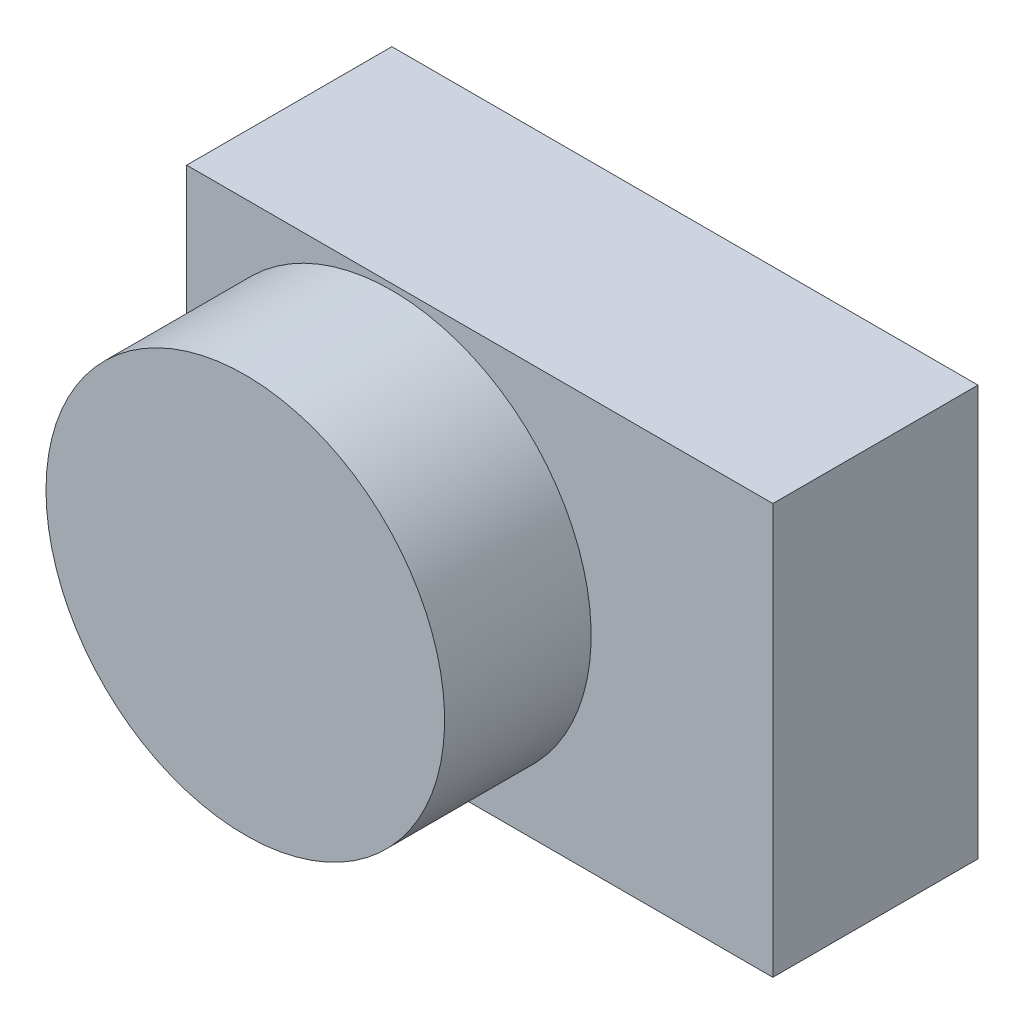
ISO-10303-21;
HEADER;
FILE_DESCRIPTION(('STEP AP214'),'2;1');
FILE_NAME('part.step','',(''),(''),'','','');
FILE_SCHEMA(('AUTOMOTIVE_DESIGN { 1 0 10303 214 1 1 1 1 }'));
ENDSEC;
DATA;
#1=APPLICATION_CONTEXT('core data for automotive mechanical design processes');
#2=APPLICATION_PROTOCOL_DEFINITION('international standard','automotive_design',2000,#1);
#3=PRODUCT_CONTEXT('',#1,'mechanical');
#4=PRODUCT('Part','Part','',(#3));
#5=PRODUCT_RELATED_PRODUCT_CATEGORY('part','',(#4));
#6=PRODUCT_DEFINITION_FORMATION('','',#4);
#7=PRODUCT_DEFINITION_CONTEXT('part definition',#1,'design');
#8=PRODUCT_DEFINITION('design','',#6,#7);
#9=PRODUCT_DEFINITION_SHAPE('','',#8);
#10=(LENGTH_UNIT() NAMED_UNIT(*) SI_UNIT(.MILLI.,.METRE.));
#11=(NAMED_UNIT(*) PLANE_ANGLE_UNIT() SI_UNIT($,.RADIAN.));
#12=(NAMED_UNIT(*) SI_UNIT($,.STERADIAN.) SOLID_ANGLE_UNIT());
#13=UNCERTAINTY_MEASURE_WITH_UNIT(LENGTH_MEASURE(1.E-05),#10,'distance_accuracy_value','');
#14=(GEOMETRIC_REPRESENTATION_CONTEXT(3) GLOBAL_UNCERTAINTY_ASSIGNED_CONTEXT((#13)) GLOBAL_UNIT_ASSIGNED_CONTEXT((#10,
#11,#12)) REPRESENTATION_CONTEXT('',''));
#15=CARTESIAN_POINT('',(0.,0.,0.));
#16=DIRECTION('',(0.,0.,1.));
#17=DIRECTION('',(1.,0.,0.));
#18=AXIS2_PLACEMENT_3D('',#15,#16,#17);
#19=CARTESIAN_POINT('',(-50.,-35.,35.));
#20=DIRECTION('',(-1.,0.,0.));
#21=DIRECTION('',(0.,0.,1.));
#22=AXIS2_PLACEMENT_3D('',#19,#20,#21);
#23=PLANE('',#22);
#24=DIRECTION('',(0.,1.,0.));
#25=VECTOR('',#24,1.);
#26=CARTESIAN_POINT('',(-50.,-35.,0.));
#27=LINE('',#26,#25);
#28=CARTESIAN_POINT('',(-50.,-35.,0.));
#29=VERTEX_POINT('',#28);
#30=CARTESIAN_POINT('',(-50.,35.,0.));
#31=VERTEX_POINT('',#30);
#32=EDGE_CURVE('E102',#29,#31,#27,.T.);
#33=ORIENTED_EDGE('',*,*,#32,.F.);
#34=DIRECTION('',(0.,0.,-1.));
#35=VECTOR('',#34,1.);
#36=CARTESIAN_POINT('',(-50.,-35.,35.));
#37=LINE('',#36,#35);
#38=CARTESIAN_POINT('',(-50.,-35.,35.));
#39=VERTEX_POINT('',#38);
#40=EDGE_CURVE('E11',#39,#29,#37,.T.);
#41=ORIENTED_EDGE('',*,*,#40,.F.);
#42=DIRECTION('',(0.,1.,0.));
#43=VECTOR('',#42,1.);
#44=CARTESIAN_POINT('',(-50.,-35.,35.));
#45=LINE('',#44,#43);
#46=CARTESIAN_POINT('',(-50.,35.,35.));
#47=VERTEX_POINT('',#46);
#48=EDGE_CURVE('E96',#39,#47,#45,.T.);
#49=ORIENTED_EDGE('',*,*,#48,.T.);
#50=DIRECTION('',(0.,0.,-1.));
#51=VECTOR('',#50,1.);
#52=CARTESIAN_POINT('',(-50.,35.,35.));
#53=LINE('',#52,#51);
#54=EDGE_CURVE('E39',#47,#31,#53,.T.);
#55=ORIENTED_EDGE('',*,*,#54,.T.);
#56=EDGE_LOOP('',(#33,#41,#49,#55));
#57=FACE_BOUND('',#56,.T.);
#58=ADVANCED_FACE('F36',(#57),#23,.T.);
#59=CARTESIAN_POINT('',(-50.,-35.,35.));
#60=DIRECTION('',(0.,1.,0.));
#61=DIRECTION('',(0.,0.,1.));
#62=AXIS2_PLACEMENT_3D('',#59,#60,#61);
#63=PLANE('',#62);
#64=DIRECTION('',(1.,0.,0.));
#65=VECTOR('',#64,1.);
#66=CARTESIAN_POINT('',(-50.,-35.,0.));
#67=LINE('',#66,#65);
#68=CARTESIAN_POINT('',(50.,-35.,0.));
#69=VERTEX_POINT('',#68);
#70=EDGE_CURVE('E69',#29,#69,#67,.T.);
#71=ORIENTED_EDGE('',*,*,#70,.T.);
#72=DIRECTION('',(0.,0.,-1.));
#73=VECTOR('',#72,1.);
#74=CARTESIAN_POINT('',(50.,-35.,35.));
#75=LINE('',#74,#73);
#76=CARTESIAN_POINT('',(50.,-35.,35.));
#77=VERTEX_POINT('',#76);
#78=EDGE_CURVE('E45',#77,#69,#75,.T.);
#79=ORIENTED_EDGE('',*,*,#78,.F.);
#80=DIRECTION('',(1.,0.,0.));
#81=VECTOR('',#80,1.);
#82=CARTESIAN_POINT('',(-50.,-35.,35.));
#83=LINE('',#82,#81);
#84=EDGE_CURVE('E86',#39,#77,#83,.T.);
#85=ORIENTED_EDGE('',*,*,#84,.F.);
#86=ORIENTED_EDGE('',*,*,#40,.T.);
#87=EDGE_LOOP('',(#71,#79,#85,#86));
#88=FACE_BOUND('',#87,.T.);
#89=ADVANCED_FACE('F113',(#88),#63,.F.);
#90=CARTESIAN_POINT('',(50.,-35.,35.));
#91=DIRECTION('',(-1.,0.,0.));
#92=DIRECTION('',(0.,0.,1.));
#93=AXIS2_PLACEMENT_3D('',#90,#91,#92);
#94=PLANE('',#93);
#95=DIRECTION('',(0.,1.,0.));
#96=VECTOR('',#95,1.);
#97=CARTESIAN_POINT('',(50.,-35.,0.));
#98=LINE('',#97,#96);
#99=CARTESIAN_POINT('',(50.,35.,0.));
#100=VERTEX_POINT('',#99);
#101=EDGE_CURVE('E93',#69,#100,#98,.T.);
#102=ORIENTED_EDGE('',*,*,#101,.T.);
#103=DIRECTION('',(0.,0.,-1.));
#104=VECTOR('',#103,1.);
#105=CARTESIAN_POINT('',(50.,35.,35.));
#106=LINE('',#105,#104);
#107=CARTESIAN_POINT('',(50.,35.,35.));
#108=VERTEX_POINT('',#107);
#109=EDGE_CURVE('E90',#108,#100,#106,.T.);
#110=ORIENTED_EDGE('',*,*,#109,.F.);
#111=DIRECTION('',(0.,1.,0.));
#112=VECTOR('',#111,1.);
#113=CARTESIAN_POINT('',(50.,-35.,35.));
#114=LINE('',#113,#112);
#115=EDGE_CURVE('E81',#77,#108,#114,.T.);
#116=ORIENTED_EDGE('',*,*,#115,.F.);
#117=ORIENTED_EDGE('',*,*,#78,.T.);
#118=EDGE_LOOP('',(#102,#110,#116,#117));
#119=FACE_BOUND('',#118,.T.);
#120=ADVANCED_FACE('F91',(#119),#94,.F.);
#121=CARTESIAN_POINT('',(-50.,35.,35.));
#122=DIRECTION('',(0.,1.,0.));
#123=DIRECTION('',(0.,0.,1.));
#124=AXIS2_PLACEMENT_3D('',#121,#122,#123);
#125=PLANE('',#124);
#126=DIRECTION('',(1.,0.,0.));
#127=VECTOR('',#126,1.);
#128=CARTESIAN_POINT('',(-50.,35.,0.));
#129=LINE('',#128,#127);
#130=EDGE_CURVE('E105',#31,#100,#129,.T.);
#131=ORIENTED_EDGE('',*,*,#130,.F.);
#132=ORIENTED_EDGE('',*,*,#54,.F.);
#133=DIRECTION('',(1.,0.,0.));
#134=VECTOR('',#133,1.);
#135=CARTESIAN_POINT('',(-50.,35.,35.));
#136=LINE('',#135,#134);
#137=EDGE_CURVE('E85',#47,#108,#136,.T.);
#138=ORIENTED_EDGE('',*,*,#137,.T.);
#139=ORIENTED_EDGE('',*,*,#109,.T.);
#140=EDGE_LOOP('',(#131,#132,#138,#139));
#141=FACE_BOUND('',#140,.T.);
#142=ADVANCED_FACE('F95',(#141),#125,.T.);
#143=CARTESIAN_POINT('',(0.,0.,35.));
#144=DIRECTION('',(0.,0.,-1.));
#145=DIRECTION('',(-1.,0.,0.));
#146=AXIS2_PLACEMENT_3D('',#143,#144,#145);
#147=PLANE('',#146);
#148=CARTESIAN_POINT('',(-15.,0.,35.));
#149=DIRECTION('',(0.,0.,-1.));
#150=DIRECTION('',(-1.,0.,0.));
#151=AXIS2_PLACEMENT_3D('',#148,#149,#150);
#152=CIRCLE('',#151,34.);
#153=CARTESIAN_POINT('',(-49.,0.,35.));
#154=VERTEX_POINT('',#153);
#155=EDGE_CURVE('E106',#154,#154,#152,.T.);
#156=ORIENTED_EDGE('',*,*,#155,.T.);
#157=EDGE_LOOP('',(#156));
#158=FACE_BOUND('',#157,.T.);
#159=ORIENTED_EDGE('',*,*,#48,.F.);
#160=ORIENTED_EDGE('',*,*,#84,.T.);
#161=ORIENTED_EDGE('',*,*,#115,.T.);
#162=ORIENTED_EDGE('',*,*,#137,.F.);
#163=EDGE_LOOP('',(#159,#160,#161,#162));
#164=FACE_BOUND('',#163,.T.);
#165=ADVANCED_FACE('F84',(#158,#164),#147,.F.);
#166=CARTESIAN_POINT('',(0.,0.,0.));
#167=DIRECTION('',(0.,0.,-1.));
#168=DIRECTION('',(-1.,0.,0.));
#169=AXIS2_PLACEMENT_3D('',#166,#167,#168);
#170=PLANE('',#169);
#171=ORIENTED_EDGE('',*,*,#32,.T.);
#172=ORIENTED_EDGE('',*,*,#130,.T.);
#173=ORIENTED_EDGE('',*,*,#101,.F.);
#174=ORIENTED_EDGE('',*,*,#70,.F.);
#175=EDGE_LOOP('',(#171,#172,#173,#174));
#176=FACE_BOUND('',#175,.T.);
#177=ADVANCED_FACE('F111',(#176),#170,.T.);
#178=CARTESIAN_POINT('',(-15.,0.,60.));
#179=DIRECTION('',(0.,0.,-1.));
#180=DIRECTION('',(-1.,0.,0.));
#181=AXIS2_PLACEMENT_3D('',#178,#179,#180);
#182=CYLINDRICAL_SURFACE('',#181,34.);
#183=CARTESIAN_POINT('',(-15.,0.,60.));
#184=DIRECTION('',(0.,0.,-1.));
#185=DIRECTION('',(-1.,0.,0.));
#186=AXIS2_PLACEMENT_3D('',#183,#184,#185);
#187=CIRCLE('',#186,34.);
#188=CARTESIAN_POINT('',(-49.,0.,60.));
#189=VERTEX_POINT('',#188);
#190=EDGE_CURVE('E145',#189,#189,#187,.T.);
#191=ORIENTED_EDGE('',*,*,#190,.T.);
#192=EDGE_LOOP('',(#191));
#193=FACE_BOUND('',#192,.T.);
#194=ORIENTED_EDGE('',*,*,#155,.F.);
#195=EDGE_LOOP('',(#194));
#196=FACE_BOUND('',#195,.T.);
#197=ADVANCED_FACE('F132',(#193,#196),#182,.T.);
#198=CARTESIAN_POINT('',(-15.,0.,60.));
#199=DIRECTION('',(0.,0.,-1.));
#200=DIRECTION('',(-1.,0.,0.));
#201=AXIS2_PLACEMENT_3D('',#198,#199,#200);
#202=PLANE('',#201);
#203=ORIENTED_EDGE('',*,*,#190,.F.);
#204=EDGE_LOOP('',(#203));
#205=FACE_BOUND('',#204,.T.);
#206=ADVANCED_FACE('F137',(#205),#202,.F.);
#207=CLOSED_SHELL('',(#58,#89,#120,#142,#165,#177,#197,#206));
#208=MANIFOLD_SOLID_BREP('B2',#207);
#209=ADVANCED_BREP_SHAPE_REPRESENTATION('',(#18,#208),#14);
#210=SHAPE_DEFINITION_REPRESENTATION(#9,#209);
ENDSEC;
END-ISO-10303-21;
